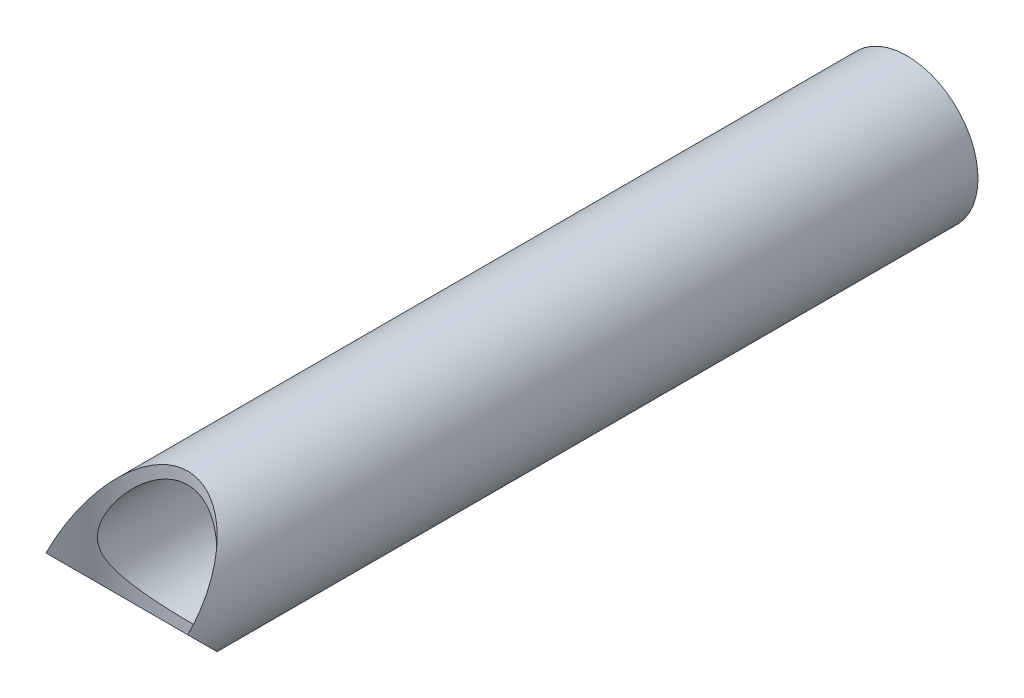
ISO-10303-21;
HEADER;
FILE_DESCRIPTION(('STEP AP214'),'2;1');
FILE_NAME('part.step','',(''),(''),'','','');
FILE_SCHEMA(('AUTOMOTIVE_DESIGN { 1 0 10303 214 1 1 1 1 }'));
ENDSEC;
DATA;
#1=APPLICATION_CONTEXT('core data for automotive mechanical design processes');
#2=APPLICATION_PROTOCOL_DEFINITION('international standard','automotive_design',2000,#1);
#3=PRODUCT_CONTEXT('',#1,'mechanical');
#4=PRODUCT('Part','Part','',(#3));
#5=PRODUCT_RELATED_PRODUCT_CATEGORY('part','',(#4));
#6=PRODUCT_DEFINITION_FORMATION('','',#4);
#7=PRODUCT_DEFINITION_CONTEXT('part definition',#1,'design');
#8=PRODUCT_DEFINITION('design','',#6,#7);
#9=PRODUCT_DEFINITION_SHAPE('','',#8);
#10=(LENGTH_UNIT() NAMED_UNIT(*) SI_UNIT(.MILLI.,.METRE.));
#11=(NAMED_UNIT(*) PLANE_ANGLE_UNIT() SI_UNIT($,.RADIAN.));
#12=(NAMED_UNIT(*) SI_UNIT($,.STERADIAN.) SOLID_ANGLE_UNIT());
#13=UNCERTAINTY_MEASURE_WITH_UNIT(LENGTH_MEASURE(1.E-05),#10,'distance_accuracy_value','');
#14=(GEOMETRIC_REPRESENTATION_CONTEXT(3) GLOBAL_UNCERTAINTY_ASSIGNED_CONTEXT((#13)) GLOBAL_UNIT_ASSIGNED_CONTEXT((#10,
#11,#12)) REPRESENTATION_CONTEXT('',''));
#15=CARTESIAN_POINT('',(0.,0.,0.));
#16=DIRECTION('',(0.,0.,1.));
#17=DIRECTION('',(1.,0.,0.));
#18=AXIS2_PLACEMENT_3D('',#15,#16,#17);
#19=CARTESIAN_POINT('',(0.,359.918,234.95));
#20=DIRECTION('',(0.,1.,0.));
#21=DIRECTION('',(1.,0.,0.));
#22=AXIS2_PLACEMENT_3D('',#19,#20,#21);
#23=CYLINDRICAL_SURFACE('',#22,21.082);
#24=CARTESIAN_POINT('',(0.,0.,234.95));
#25=DIRECTION('',(0.,0.707106781186548,-0.707106781186548));
#26=DIRECTION('',(0.,0.707106781186548,0.707106781186548));
#27=AXIS2_PLACEMENT_3D('',#24,#25,#26);
#28=ELLIPSE('',#27,29.8144503219496,21.082);
#29=CARTESIAN_POINT('',(21.082,0.,234.95));
#30=VERTEX_POINT('',#29);
#31=CARTESIAN_POINT('',(-21.082,0.,234.95));
#32=VERTEX_POINT('',#31);
#33=EDGE_CURVE('E26',#30,#32,#28,.T.);
#34=ORIENTED_EDGE('',*,*,#33,.F.);
#35=CARTESIAN_POINT('',(0.,0.,234.95));
#36=DIRECTION('',(0.,-0.707106781186547,-0.707106781186548));
#37=DIRECTION('',(0.,-0.707106781186548,0.707106781186547));
#38=AXIS2_PLACEMENT_3D('',#35,#36,#37);
#39=ELLIPSE('',#38,29.8144503219496,21.082);
#40=EDGE_CURVE('E35',#32,#30,#39,.T.);
#41=ORIENTED_EDGE('',*,*,#40,.F.);
#42=EDGE_LOOP('',(#34,#41));
#43=FACE_BOUND('',#42,.T.);
#44=CARTESIAN_POINT('',(-17.526,0.,223.232916403815));
#45=CARTESIAN_POINT('',(-17.5260016378947,0.311185239624758,223.232920576468));
#46=CARTESIAN_POINT('',(-17.5176931015294,0.622351445218561,223.220463044685));
#47=CARTESIAN_POINT('',(-17.4846988539183,1.24185385401228,223.171337247352));
#48=CARTESIAN_POINT('',(-17.4600137345834,1.55019015908704,223.134669856837));
#49=CARTESIAN_POINT('',(-17.3948143787621,2.16244529665251,223.038892293605));
#50=CARTESIAN_POINT('',(-17.3542585500645,2.46635032751231,222.979723162382));
#51=CARTESIAN_POINT('',(-17.2582022882152,3.06720718463189,222.841646255183));
#52=CARTESIAN_POINT('',(-17.2026991564801,3.36415774479986,222.762734915134));
#53=CARTESIAN_POINT('',(-17.0535843130683,4.06302745628092,222.554514583881));
#54=CARTESIAN_POINT('',(-16.9535301925097,4.46127907530088,222.417504587144));
#55=CARTESIAN_POINT('',(-16.7288372054571,5.24134070736921,222.119115857577));
#56=CARTESIAN_POINT('',(-16.6041869119637,5.62314297747683,221.957725806354));
#57=CARTESIAN_POINT('',(-16.3317636320621,6.37126683424937,221.616886105196));
#58=CARTESIAN_POINT('',(-16.1839327090337,6.73754662963666,221.437391618071));
#59=CARTESIAN_POINT('',(-15.8666576854035,7.45408327588811,221.066211695548));
#60=CARTESIAN_POINT('',(-15.6972143279038,7.80434067708934,220.87452667941));
#61=CARTESIAN_POINT('',(-15.2583916209031,8.64017899381099,220.397395101938));
#62=CARTESIAN_POINT('',(-14.9778300302294,9.11754391622343,220.107781370552));
#63=CARTESIAN_POINT('',(-14.3747358658228,10.0415160632169,219.522931033636));
#64=CARTESIAN_POINT('',(-14.0521855719281,10.4881101794549,219.227692099307));
#65=CARTESIAN_POINT('',(-13.3658527392673,11.3497898907658,218.640229116725));
#66=CARTESIAN_POINT('',(-13.0021052837983,11.7649018003026,218.348002730994));
#67=CARTESIAN_POINT('',(-12.233300311435,12.5623875794975,217.773643246075));
#68=CARTESIAN_POINT('',(-11.8282584025823,12.9447737187121,217.491506387419));
#69=CARTESIAN_POINT('',(-11.0669192234582,13.5970346278618,217.001924678131));
#70=CARTESIAN_POINT('',(-10.7183987975033,13.8736134382401,216.791291401135));
#71=CARTESIAN_POINT('',(-9.99596445975378,14.4028407038532,216.383811718799));
#72=CARTESIAN_POINT('',(-9.62205154611134,14.6554900987946,216.18696477215));
#73=CARTESIAN_POINT('',(-8.85000453279145,15.1342035654356,215.810712864664));
#74=CARTESIAN_POINT('',(-8.45190333226405,15.3603025729126,215.631285038382));
#75=CARTESIAN_POINT('',(-7.6322440039898,15.7836038697299,215.293041772981));
#76=CARTESIAN_POINT('',(-7.21069012767879,15.9808113730436,215.134222615263));
#77=CARTESIAN_POINT('',(-6.42051007803401,16.3122154450185,214.865909842073));
#78=CARTESIAN_POINT('',(-6.05526187412117,16.4514151662288,214.752631333809));
#79=CARTESIAN_POINT('',(-5.31159989558675,16.706346482185,214.544445747569));
#80=CARTESIAN_POINT('',(-4.93318862342572,16.822082509407,214.449535199894));
#81=CARTESIAN_POINT('',(-4.16529168273308,17.0284767212216,214.279837501013));
#82=CARTESIAN_POINT('',(-3.77580987215478,17.1191435267946,214.205043432253));
#83=CARTESIAN_POINT('',(-2.98810662755949,17.2740554751118,214.077023779287));
#84=CARTESIAN_POINT('',(-2.58988509279095,17.3383003130948,214.023798443865));
#85=CARTESIAN_POINT('',(-1.78589985576376,17.4394973865413,213.939875956407));
#86=CARTESIAN_POINT('',(-1.38011148961265,17.4763337840664,213.90927442415));
#87=CARTESIAN_POINT('',(-0.565854491199014,17.5216078754302,213.871654926066));
#88=CARTESIAN_POINT('',(-0.157385853351223,17.5300455100714,213.864637009399));
#89=CARTESIAN_POINT('',(0.658840305394864,17.5183673988472,213.874344983027));
#90=CARTESIAN_POINT('',(1.06659785274317,17.4982527387285,213.89106997046));
#91=CARTESIAN_POINT('',(1.87807893983288,17.4298388579758,213.947881842556));
#92=CARTESIAN_POINT('',(2.2818026150163,17.3815405868964,213.987967940143));
#93=CARTESIAN_POINT('',(3.05546264031583,17.2617419142674,214.087192453489));
#94=CARTESIAN_POINT('',(3.42586003012292,17.1919987114047,214.144886067911));
#95=CARTESIAN_POINT('',(4.1581733690984,17.0297069941817,214.27879136849));
#96=CARTESIAN_POINT('',(4.52008977395023,16.937159708176,214.355002057212));
#97=CARTESIAN_POINT('',(5.23359484929571,16.7304558932916,214.524655034813));
#98=CARTESIAN_POINT('',(5.58518194067371,16.6162960800062,214.618099942681));
#99=CARTESIAN_POINT('',(6.27643426134677,16.3677116370536,214.820746377781));
#100=CARTESIAN_POINT('',(6.61609878682277,16.2332858135048,214.929948833282));
#101=CARTESIAN_POINT('',(7.31109089686548,15.9331108592373,215.172598831599));
#102=CARTESIAN_POINT('',(7.6652351304986,15.765658679436,215.307326089951));
#103=CARTESIAN_POINT('',(8.35689209437836,15.4101996598829,215.59146450325));
#104=CARTESIAN_POINT('',(8.69440404672023,15.2221918600498,215.74087634403));
#105=CARTESIAN_POINT('',(9.35209844960764,14.8272083285566,216.052344158627));
#106=CARTESIAN_POINT('',(9.67227794419844,14.6202293775806,216.214402277764));
#107=CARTESIAN_POINT('',(10.2948186721717,14.1887580520627,216.54912038901));
#108=CARTESIAN_POINT('',(10.5971773894446,13.9642632148072,216.721781871211));
#109=CARTESIAN_POINT('',(11.244684971049,13.4507289160127,217.112431205893));
#110=CARTESIAN_POINT('',(11.5856940585288,13.1579624545575,217.332390028793));
#111=CARTESIAN_POINT('',(12.2411720036753,12.5504633562744,217.781357662782));
#112=CARTESIAN_POINT('',(12.5556369249827,12.2357274740969,218.010367808766));
#113=CARTESIAN_POINT('',(13.1584286905594,11.5850519846574,218.474220690238));
#114=CARTESIAN_POINT('',(13.446714754031,11.2490806325737,218.709071823611));
#115=CARTESIAN_POINT('',(13.9965511777057,10.5571079156422,219.180460341437));
#116=CARTESIAN_POINT('',(14.2581033442004,10.2011079065657,219.416997610808));
#117=CARTESIAN_POINT('',(14.7570366580727,9.46521810556998,219.890118252494));
#118=CARTESIAN_POINT('',(14.9941216137858,9.08510932065604,220.126673741046));
#119=CARTESIAN_POINT('',(15.4403622641035,8.30410846278525,220.592080789485));
#120=CARTESIAN_POINT('',(15.6495111177599,7.90321133245438,220.820930452158));
#121=CARTESIAN_POINT('',(16.0384509266286,7.08063883642229,221.264038398843));
#122=CARTESIAN_POINT('',(16.2182912005026,6.65899996365617,221.4783208339));
#123=CARTESIAN_POINT('',(16.5471956443401,5.79353295482919,221.884426709669));
#124=CARTESIAN_POINT('',(16.696280162227,5.34971973228996,222.076264962783));
#125=CARTESIAN_POINT('',(16.9096872269796,4.61599174217148,222.359073923371));
#126=CARTESIAN_POINT('',(16.9844727479109,4.33305990670587,222.460330812437));
#127=CARTESIAN_POINT('',(17.1206528131974,3.75910386380242,222.647668330948));
#128=CARTESIAN_POINT('',(17.1820521342226,3.46808258489746,222.733754371779));
#129=CARTESIAN_POINT('',(17.2904590721008,2.87925352198578,222.887677568371));
#130=CARTESIAN_POINT('',(17.3374971591084,2.58146156719814,222.955553323142));
#131=CARTESIAN_POINT('',(17.4164527674171,1.97986154206126,223.070488887695));
#132=CARTESIAN_POINT('',(17.4483707185722,1.67605364299662,223.117549289238));
#133=CARTESIAN_POINT('',(17.4965707933311,1.06142244679821,223.188935510472));
#134=CARTESIAN_POINT('',(17.5126944221406,0.750559438662827,223.213030813523));
#135=CARTESIAN_POINT('',(17.5283064038534,0.127486752535089,223.236358168602));
#136=CARTESIAN_POINT('',(17.5277956602287,-0.184722851397914,223.235591570968));
#137=CARTESIAN_POINT('',(17.5101485211154,-0.807835261309496,223.209230673787));
#138=CARTESIAN_POINT('',(17.4929998394571,-1.11873693105039,223.183618026849));
#139=CARTESIAN_POINT('',(17.4425276727906,-1.73636752581666,223.108929473549));
#140=CARTESIAN_POINT('',(17.4092017106118,-2.04309580438802,223.059849973807));
#141=CARTESIAN_POINT('',(17.3202684324222,-2.70129580173782,222.93059244201));
#142=CARTESIAN_POINT('',(17.2618591297115,-3.05163094171091,222.846575984127));
#143=CARTESIAN_POINT('',(17.125544653635,-3.74168673817614,222.654461803903));
#144=CARTESIAN_POINT('',(17.0476346833835,-4.08140475984634,222.546358157176));
#145=CARTESIAN_POINT('',(16.8735380534471,-4.75017183758828,222.310540275106));
#146=CARTESIAN_POINT('',(16.7773015999041,-5.07918889906022,222.182772798029));
#147=CARTESIAN_POINT('',(16.5679251651736,-5.7253729147127,221.912213193129));
#148=CARTESIAN_POINT('',(16.4547840559982,-6.0425390763578,221.769420062885));
#149=CARTESIAN_POINT('',(16.1420461654977,-6.84649854955791,221.386201584798));
#150=CARTESIAN_POINT('',(15.9304484628452,-7.32461540499267,221.137310635666));
#151=CARTESIAN_POINT('',(15.469742749578,-8.25327584896662,220.623199530561));
#152=CARTESIAN_POINT('',(15.2206141148923,-8.7038040843026,220.357970444086));
#153=CARTESIAN_POINT('',(14.6857838585869,-9.57870297739553,219.819811324868));
#154=CARTESIAN_POINT('',(14.4000361208074,-10.0030396349768,219.546871925969));
#155=CARTESIAN_POINT('',(13.7927902751821,-10.8250002111714,219.000816583185));
#156=CARTESIAN_POINT('',(13.4712992021977,-11.2226293616245,218.727700684521));
#157=CARTESIAN_POINT('',(12.7799006234576,-12.0048882555959,218.177183513066));
#158=CARTESIAN_POINT('',(12.4086316211085,-12.3884749126374,217.900004263197));
#159=CARTESIAN_POINT('',(11.6276478455591,-13.1242664808955,217.358111182677));
#160=CARTESIAN_POINT('',(11.2179265250184,-13.4764660277999,217.093399486463));
#161=CARTESIAN_POINT('',(10.3612672323301,-14.145646554196,216.583109585168));
#162=CARTESIAN_POINT('',(9.91442105137385,-14.462710124753,216.337486933743));
#163=CARTESIAN_POINT('',(9.21669876910987,-14.9093724844698,215.987644535389));
#164=CARTESIAN_POINT('',(8.97958368951613,-15.0534199394608,215.874143339074));
#165=CARTESIAN_POINT('',(8.49628270026576,-15.3313920219186,215.654031190626));
#166=CARTESIAN_POINT('',(8.25009466435522,-15.4653142538034,215.547421869939));
#167=CARTESIAN_POINT('',(7.64828647045936,-15.7740353493854,215.30061035176));
#168=CARTESIAN_POINT('',(7.28844211338092,-15.9436374285179,215.164122028001));
#169=CARTESIAN_POINT('',(6.55290444190074,-16.2597758929261,214.908500182969));
#170=CARTESIAN_POINT('',(6.17721525857184,-16.4063182437829,214.789362173745));
#171=CARTESIAN_POINT('',(5.41170805813667,-16.6744852599453,214.570537278293));
#172=CARTESIAN_POINT('',(5.02189676543478,-16.7961216056681,214.470841275202));
#173=CARTESIAN_POINT('',(4.23014401773315,-17.012789133161,214.292768054905));
#174=CARTESIAN_POINT('',(3.82820225407397,-17.1078196373129,214.214391380677));
#175=CARTESIAN_POINT('',(3.01240280049653,-17.2702087031939,214.08021204066));
#176=CARTESIAN_POINT('',(2.59848725210838,-17.3373944048851,214.024550421275));
#177=CARTESIAN_POINT('',(1.76434657958655,-17.4420303309739,213.937774667527));
#178=CARTESIAN_POINT('',(1.34412146523764,-17.4794806014797,213.906660495102));
#179=CARTESIAN_POINT('',(0.501049558004232,-17.5239199181906,213.869732822199));
#180=CARTESIAN_POINT('',(0.0782034121153622,-17.5309162037693,213.863913308798));
#181=CARTESIAN_POINT('',(-0.766452841317332,-17.5143262226544,213.877704265793));
#182=CARTESIAN_POINT('',(-1.18826301601357,-17.4907419935961,213.897313041855));
#183=CARTESIAN_POINT('',(-1.98788490913911,-17.4170841881761,213.958466017283));
#184=CARTESIAN_POINT('',(-2.36612013468807,-17.3696960042558,213.997785792111));
#185=CARTESIAN_POINT('',(-3.11616450870986,-17.2509229834362,214.096144659424));
#186=CARTESIAN_POINT('',(-3.48797413891219,-17.1795399537179,214.155182266851));
#187=CARTESIAN_POINT('',(-4.22296419237805,-17.0137946902071,214.291900754034));
#188=CARTESIAN_POINT('',(-4.58614351078464,-16.9194295314405,214.369584006834));
#189=CARTESIAN_POINT('',(-5.30192354415744,-16.7089637385302,214.542258850889));
#190=CARTESIAN_POINT('',(-5.65452365219898,-16.5928618601163,214.637251432968));
#191=CARTESIAN_POINT('',(-6.36399761707214,-16.3343025519063,214.847920397852));
#192=CARTESIAN_POINT('',(-6.72028282825474,-16.1908572417631,214.964363371825));
#193=CARTESIAN_POINT('',(-7.41814865422396,-15.8832360301541,215.212750891921));
#194=CARTESIAN_POINT('',(-7.75972923075394,-15.7190600747585,215.34469547837));
#195=CARTESIAN_POINT('',(-8.42721585313398,-15.3715416074325,215.622211851147));
#196=CARTESIAN_POINT('',(-8.75312180549422,-15.1881989812051,215.76778371874));
#197=CARTESIAN_POINT('',(-9.38863490224724,-14.8037894086195,216.070692933135));
#198=CARTESIAN_POINT('',(-9.69823878032591,-14.6027189316968,216.228032622591));
#199=CARTESIAN_POINT('',(-10.4414710002701,-14.0863757170536,216.628473109802));
#200=CARTESIAN_POINT('',(-10.8654797714758,-13.7616297139406,216.877303695192));
#201=CARTESIAN_POINT('',(-11.676882138659,-13.0802149259052,217.390620647749));
#202=CARTESIAN_POINT('',(-12.064261019764,-12.723533423006,217.655113237817));
#203=CARTESIAN_POINT('',(-12.8036491868346,-11.9792953739005,218.195071184411));
#204=CARTESIAN_POINT('',(-13.1555093209753,-11.5916199606556,218.470576539285));
#205=CARTESIAN_POINT('',(-13.8219877892586,-10.7882226138892,219.025449233679));
#206=CARTESIAN_POINT('',(-14.136612049617,-10.3725051599325,219.304815950725));
#207=CARTESIAN_POINT('',(-14.7337377450349,-9.50576680677231,219.865624184212));
#208=CARTESIAN_POINT('',(-15.0155658912319,-9.05424836320315,220.14701378704));
#209=CARTESIAN_POINT('',(-15.539827617017,-8.12162517178265,220.698368278416));
#210=CARTESIAN_POINT('',(-15.7822404962628,-7.64050505920319,220.968327108996));
#211=CARTESIAN_POINT('',(-16.1140950182191,-6.89707752392885,221.355313166977));
#212=CARTESIAN_POINT('',(-16.2192180576643,-6.64623211980645,221.481053729276));
#213=CARTESIAN_POINT('',(-16.4187602672639,-6.13676732769555,221.725028108196));
#214=CARTESIAN_POINT('',(-16.5131786075082,-5.87814733892564,221.843261342479));
#215=CARTESIAN_POINT('',(-16.7794342334218,-5.09093726520824,222.183486857453));
#216=CARTESIAN_POINT('',(-16.9346599661884,-4.55013693174747,222.391466830595));
#217=CARTESIAN_POINT('',(-17.1391936180726,-3.67633247278779,222.673394984409));
#218=CARTESIAN_POINT('',(-17.205406088342,-3.35339503807188,222.76662094069));
#219=CARTESIAN_POINT('',(-17.3201691751224,-2.69865889204738,222.930330723315));
#220=CARTESIAN_POINT('',(-17.3687234597521,-2.36686203648769,223.000819272536));
#221=CARTESIAN_POINT('',(-17.4468189322611,-1.69770604668943,223.115133477598));
#222=CARTESIAN_POINT('',(-17.476429342286,-1.36037183699508,223.159056174266));
#223=CARTESIAN_POINT('',(-17.5160177178801,-0.682017146869614,223.217943491377));
#224=CARTESIAN_POINT('',(-17.5259982051931,-0.340997145591292,223.232911831416));
#225=CARTESIAN_POINT('',(-17.526,0.,223.232916403815));
#226=B_SPLINE_CURVE_WITH_KNOTS('',3,(#44,#45,#46,#47,#48,#49,#50,#51,#52,#53,#54,#55,#56,#57,
#58,#59,#60,#61,#62,#63,#64,#65,#66,#67,#68,#69,#70,#71,#72,#73,#74,#75,#76,#77,#78,#79,#80,#81,
#82,#83,#84,#85,#86,#87,#88,#89,#90,#91,#92,#93,#94,#95,#96,#97,#98,#99,#100,#101,#102,#103,
#104,#105,#106,#107,#108,#109,#110,#111,#112,#113,#114,#115,#116,#117,#118,#119,#120,#121,#122,
#123,#124,#125,#126,#127,#128,#129,#130,#131,#132,#133,#134,#135,#136,#137,#138,#139,#140,#141,
#142,#143,#144,#145,#146,#147,#148,#149,#150,#151,#152,#153,#154,#155,#156,#157,#158,#159,#160,
#161,#162,#163,#164,#165,#166,#167,#168,#169,#170,#171,#172,#173,#174,#175,#176,#177,#178,#179,
#180,#181,#182,#183,#184,#185,#186,#187,#188,#189,#190,#191,#192,#193,#194,#195,#196,#197,#198,
#199,#200,#201,#202,#203,#204,#205,#206,#207,#208,#209,#210,#211,#212,#213,#214,#215,#216,#217,
#218,#219,#220,#221,#222,#223,#224,#225),.UNSPECIFIED.,.T.,.F.,(4,2,2,2,2,2,2,2,2,2,2,2,2,2,2,2,
2,2,2,2,2,2,2,2,2,2,2,2,2,2,2,2,2,2,2,2,2,2,2,2,2,2,2,2,2,2,2,2,2,2,2,2,2,2,2,2,2,2,2,2,2,2,2,2,
2,2,2,2,2,2,2,2,2,2,2,2,2,2,2,2,2,2,2,2,2,2,2,2,2,2,4),(0.,0.933172693022051,1.86631165953259,
2.80191264993149,3.73768266693524,5.03421487261753,6.33135085124985,7.63178208439843,
8.93216861675469,10.8043377121159,12.6772994813249,14.5486780714614,16.4193519416874,
17.8948685619845,19.3703272147972,20.8438221291615,22.3170507973489,23.5367196852798,
24.7561579530497,25.9751763487712,27.1942088047281,28.4183645138434,29.6425227747185,
30.8666344862649,32.0907049577553,33.2333470618126,34.3759276302668,35.5186819736788,
36.6615036636894,37.9030932180036,39.1447407874231,40.3865994501214,41.6286330324567,
43.1283930869264,44.6283751585665,46.1306551588403,47.6328335894824,49.1514688241532,
50.670475260672,52.1868986081185,53.7023154536196,54.6306896856113,55.5587320966309,
56.484791577948,57.4108247305145,58.3460581596758,59.2812407930624,60.2171145315851,
61.1531316224146,62.2463414280461,63.3398204124099,64.4363139481779,65.5328806817876,
67.267471533013,69.003019080611,70.740774167745,72.4781878402609,74.2806100835346,
76.0833397869958,77.8817378217741,78.7806894706805,79.6798531461849,80.9403031602998,
82.2004265563947,83.4599576194235,84.7195207582446,85.9867901712292,87.2540576191571,
88.5210238019549,89.787905568829,90.9362330678383,92.0844740994954,93.2328613461459,
94.3813143497834,95.5841651482628,96.7870190759765,97.9898801771085,99.1929813757515,
100.958060446859,102.723845595493,104.496761581516,106.269395021408,108.073655659627,
109.878860830614,110.77743100118,111.676070788202,113.470212940669,114.496902002416,
115.523377668994,116.546080774989,117.568652491591),.UNSPECIFIED.);
#227=CARTESIAN_POINT('',(-17.526,0.,223.232916403815));
#228=VERTEX_POINT('',#227);
#229=EDGE_CURVE('E10',#228,#228,#226,.F.);
#230=ORIENTED_EDGE('',*,*,#229,.F.);
#231=EDGE_LOOP('',(#230));
#232=FACE_BOUND('',#231,.T.);
#233=ADVANCED_FACE('F16',(#43,#232),#23,.F.);
#234=CARTESIAN_POINT('',(0.,0.,0.));
#235=DIRECTION('',(0.,0.,1.));
#236=DIRECTION('',(1.,0.,0.));
#237=AXIS2_PLACEMENT_3D('',#234,#235,#236);
#238=CYLINDRICAL_SURFACE('',#237,17.526);
#239=ORIENTED_EDGE('',*,*,#229,.T.);
#240=EDGE_LOOP('',(#239));
#241=FACE_BOUND('',#240,.T.);
#242=CARTESIAN_POINT('',(0.,0.,0.));
#243=DIRECTION('',(0.,0.,1.));
#244=DIRECTION('',(1.,0.,0.));
#245=AXIS2_PLACEMENT_3D('',#242,#243,#244);
#246=CIRCLE('',#245,17.526);
#247=CARTESIAN_POINT('',(17.526,0.,0.));
#248=VERTEX_POINT('',#247);
#249=EDGE_CURVE('E20',#248,#248,#246,.T.);
#250=ORIENTED_EDGE('',*,*,#249,.F.);
#251=EDGE_LOOP('',(#250));
#252=FACE_BOUND('',#251,.T.);
#253=ADVANCED_FACE('F45',(#241,#252),#238,.F.);
#254=CARTESIAN_POINT('',(0.,0.,0.));
#255=DIRECTION('',(0.,0.,1.));
#256=DIRECTION('',(1.,0.,0.));
#257=AXIS2_PLACEMENT_3D('',#254,#255,#256);
#258=CYLINDRICAL_SURFACE('',#257,21.082);
#259=ORIENTED_EDGE('',*,*,#33,.T.);
#260=ORIENTED_EDGE('',*,*,#40,.T.);
#261=EDGE_LOOP('',(#259,#260));
#262=FACE_BOUND('',#261,.T.);
#263=CARTESIAN_POINT('',(0.,0.,0.));
#264=DIRECTION('',(0.,0.,1.));
#265=DIRECTION('',(1.,0.,0.));
#266=AXIS2_PLACEMENT_3D('',#263,#264,#265);
#267=CIRCLE('',#266,21.082);
#268=CARTESIAN_POINT('',(21.082,0.,0.));
#269=VERTEX_POINT('',#268);
#270=EDGE_CURVE('E38',#269,#269,#267,.F.);
#271=ORIENTED_EDGE('',*,*,#270,.F.);
#272=EDGE_LOOP('',(#271));
#273=FACE_BOUND('',#272,.T.);
#274=ADVANCED_FACE('F18',(#262,#273),#258,.T.);
#275=CARTESIAN_POINT('',(0.,0.,0.));
#276=DIRECTION('',(0.,0.,1.));
#277=DIRECTION('',(1.,0.,0.));
#278=AXIS2_PLACEMENT_3D('',#275,#276,#277);
#279=PLANE('',#278);
#280=ORIENTED_EDGE('',*,*,#270,.T.);
#281=EDGE_LOOP('',(#280));
#282=FACE_BOUND('',#281,.T.);
#283=ORIENTED_EDGE('',*,*,#249,.T.);
#284=EDGE_LOOP('',(#283));
#285=FACE_BOUND('',#284,.T.);
#286=ADVANCED_FACE('F50',(#282,#285),#279,.F.);
#287=CLOSED_SHELL('',(#233,#253,#274,#286));
#288=MANIFOLD_SOLID_BREP('B1',#287);
#289=ADVANCED_BREP_SHAPE_REPRESENTATION('',(#18,#288),#14);
#290=SHAPE_DEFINITION_REPRESENTATION(#9,#289);
ENDSEC;
END-ISO-10303-21;
